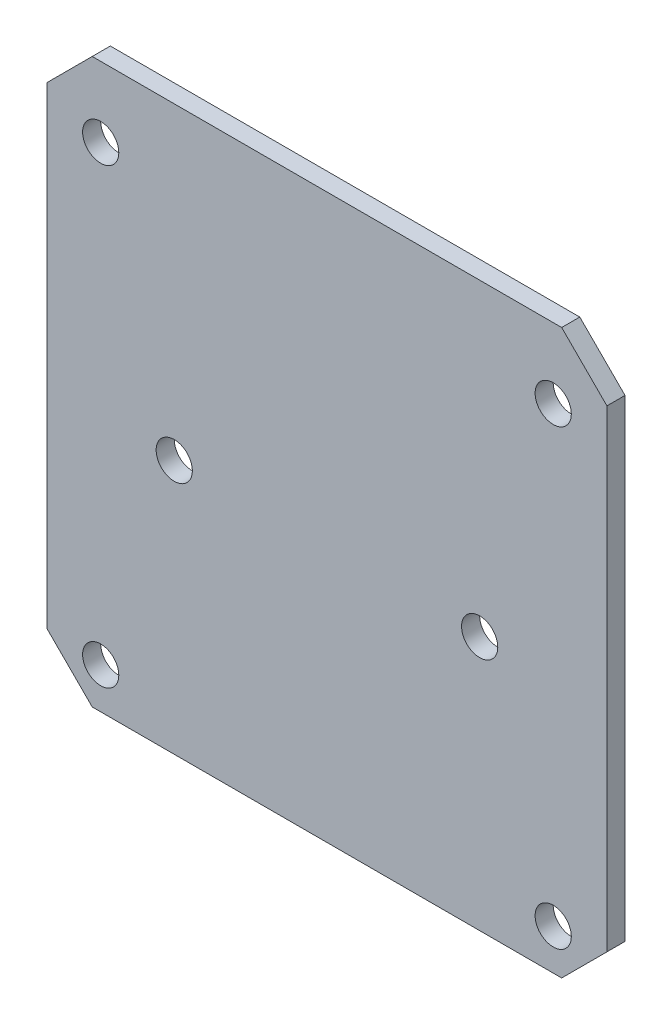
ISO-10303-21;
HEADER;
FILE_DESCRIPTION(('STEP AP214'),'2;1');
FILE_NAME('part.step','',(''),(''),'','','');
FILE_SCHEMA(('AUTOMOTIVE_DESIGN { 1 0 10303 214 1 1 1 1 }'));
ENDSEC;
DATA;
#1=APPLICATION_CONTEXT('core data for automotive mechanical design processes');
#2=APPLICATION_PROTOCOL_DEFINITION('international standard','automotive_design',2000,#1);
#3=PRODUCT_CONTEXT('',#1,'mechanical');
#4=PRODUCT('Part','Part','',(#3));
#5=PRODUCT_RELATED_PRODUCT_CATEGORY('part','',(#4));
#6=PRODUCT_DEFINITION_FORMATION('','',#4);
#7=PRODUCT_DEFINITION_CONTEXT('part definition',#1,'design');
#8=PRODUCT_DEFINITION('design','',#6,#7);
#9=PRODUCT_DEFINITION_SHAPE('','',#8);
#10=(LENGTH_UNIT() NAMED_UNIT(*) SI_UNIT(.MILLI.,.METRE.));
#11=(NAMED_UNIT(*) PLANE_ANGLE_UNIT() SI_UNIT($,.RADIAN.));
#12=(NAMED_UNIT(*) SI_UNIT($,.STERADIAN.) SOLID_ANGLE_UNIT());
#13=UNCERTAINTY_MEASURE_WITH_UNIT(LENGTH_MEASURE(1.E-05),#10,'distance_accuracy_value','');
#14=(GEOMETRIC_REPRESENTATION_CONTEXT(3) GLOBAL_UNCERTAINTY_ASSIGNED_CONTEXT((#13)) GLOBAL_UNIT_ASSIGNED_CONTEXT((#10,
#11,#12)) REPRESENTATION_CONTEXT('',''));
#15=CARTESIAN_POINT('',(0.,0.,0.));
#16=DIRECTION('',(0.,0.,1.));
#17=DIRECTION('',(1.,0.,0.));
#18=AXIS2_PLACEMENT_3D('',#15,#16,#17);
#19=CARTESIAN_POINT('',(-20.,18.7,1.6));
#20=DIRECTION('',(0.,0.,1.));
#21=DIRECTION('',(1.,0.,0.));
#22=AXIS2_PLACEMENT_3D('',#19,#20,#21);
#23=CYLINDRICAL_SURFACE('',#22,1.6);
#24=DIRECTION('',(0.,0.,-1.));
#25=VECTOR('',#24,1.);
#26=CARTESIAN_POINT('',(-18.4,18.7,1.6));
#27=LINE('',#26,#25);
#28=CARTESIAN_POINT('',(-18.4,18.7,1.6));
#29=VERTEX_POINT('',#28);
#30=CARTESIAN_POINT('',(-18.4,18.7,0.));
#31=VERTEX_POINT('',#30);
#32=EDGE_CURVE('E11',#29,#31,#27,.T.);
#33=ORIENTED_EDGE('',*,*,#32,.T.);
#34=CARTESIAN_POINT('',(-20.,18.7,0.));
#35=DIRECTION('',(0.,0.,1.));
#36=DIRECTION('',(1.,0.,0.));
#37=AXIS2_PLACEMENT_3D('',#34,#35,#36);
#38=CIRCLE('',#37,1.6);
#39=EDGE_CURVE('E168',#31,#31,#38,.T.);
#40=ORIENTED_EDGE('',*,*,#39,.F.);
#41=ORIENTED_EDGE('',*,*,#32,.F.);
#42=CARTESIAN_POINT('',(-20.,18.7,1.6));
#43=DIRECTION('',(0.,0.,1.));
#44=DIRECTION('',(1.,0.,0.));
#45=AXIS2_PLACEMENT_3D('',#42,#43,#44);
#46=CIRCLE('',#45,1.6);
#47=EDGE_CURVE('E179',#29,#29,#46,.T.);
#48=ORIENTED_EDGE('',*,*,#47,.T.);
#49=EDGE_LOOP('',(#33,#40,#41,#48));
#50=FACE_BOUND('',#49,.T.);
#51=ADVANCED_FACE('F16',(#50),#23,.F.);
#52=CARTESIAN_POINT('',(20.,18.7,1.6));
#53=DIRECTION('',(0.,0.,1.));
#54=DIRECTION('',(1.,0.,0.));
#55=AXIS2_PLACEMENT_3D('',#52,#53,#54);
#56=CYLINDRICAL_SURFACE('',#55,1.6);
#57=DIRECTION('',(0.,0.,-1.));
#58=VECTOR('',#57,1.);
#59=CARTESIAN_POINT('',(21.6,18.7,1.6));
#60=LINE('',#59,#58);
#61=CARTESIAN_POINT('',(21.6,18.7,1.6));
#62=VERTEX_POINT('',#61);
#63=CARTESIAN_POINT('',(21.6,18.7,0.));
#64=VERTEX_POINT('',#63);
#65=EDGE_CURVE('E27',#62,#64,#60,.T.);
#66=ORIENTED_EDGE('',*,*,#65,.T.);
#67=CARTESIAN_POINT('',(20.,18.7,0.));
#68=DIRECTION('',(0.,0.,1.));
#69=DIRECTION('',(1.,0.,0.));
#70=AXIS2_PLACEMENT_3D('',#67,#68,#69);
#71=CIRCLE('',#70,1.6);
#72=EDGE_CURVE('E196',#64,#64,#71,.T.);
#73=ORIENTED_EDGE('',*,*,#72,.F.);
#74=ORIENTED_EDGE('',*,*,#65,.F.);
#75=CARTESIAN_POINT('',(20.,18.7,1.6));
#76=DIRECTION('',(0.,0.,1.));
#77=DIRECTION('',(1.,0.,0.));
#78=AXIS2_PLACEMENT_3D('',#75,#76,#77);
#79=CIRCLE('',#78,1.6);
#80=EDGE_CURVE('E175',#62,#62,#79,.T.);
#81=ORIENTED_EDGE('',*,*,#80,.T.);
#82=EDGE_LOOP('',(#66,#73,#74,#81));
#83=FACE_BOUND('',#82,.T.);
#84=ADVANCED_FACE('F480',(#83),#56,.F.);
#85=CARTESIAN_POINT('',(-13.5,-2.4,1.6));
#86=DIRECTION('',(0.,0.,1.));
#87=DIRECTION('',(1.,0.,0.));
#88=AXIS2_PLACEMENT_3D('',#85,#86,#87);
#89=CYLINDRICAL_SURFACE('',#88,1.6);
#90=DIRECTION('',(0.,0.,-1.));
#91=VECTOR('',#90,1.);
#92=CARTESIAN_POINT('',(-11.9,-2.4,1.6));
#93=LINE('',#92,#91);
#94=CARTESIAN_POINT('',(-11.9,-2.4,1.6));
#95=VERTEX_POINT('',#94);
#96=CARTESIAN_POINT('',(-11.9,-2.4,0.));
#97=VERTEX_POINT('',#96);
#98=EDGE_CURVE('E217',#95,#97,#93,.T.);
#99=ORIENTED_EDGE('',*,*,#98,.T.);
#100=CARTESIAN_POINT('',(-13.5,-2.4,0.));
#101=DIRECTION('',(0.,0.,1.));
#102=DIRECTION('',(1.,0.,0.));
#103=AXIS2_PLACEMENT_3D('',#100,#101,#102);
#104=CIRCLE('',#103,1.6);
#105=EDGE_CURVE('E192',#97,#97,#104,.T.);
#106=ORIENTED_EDGE('',*,*,#105,.F.);
#107=ORIENTED_EDGE('',*,*,#98,.F.);
#108=CARTESIAN_POINT('',(-13.5,-2.4,1.6));
#109=DIRECTION('',(0.,0.,1.));
#110=DIRECTION('',(1.,0.,0.));
#111=AXIS2_PLACEMENT_3D('',#108,#109,#110);
#112=CIRCLE('',#111,1.6);
#113=EDGE_CURVE('E180',#95,#95,#112,.T.);
#114=ORIENTED_EDGE('',*,*,#113,.T.);
#115=EDGE_LOOP('',(#99,#106,#107,#114));
#116=FACE_BOUND('',#115,.T.);
#117=ADVANCED_FACE('F259',(#116),#89,.F.);
#118=CARTESIAN_POINT('',(-20.,-21.3,1.6));
#119=DIRECTION('',(0.,0.,1.));
#120=DIRECTION('',(1.,0.,0.));
#121=AXIS2_PLACEMENT_3D('',#118,#119,#120);
#122=CYLINDRICAL_SURFACE('',#121,1.6);
#123=DIRECTION('',(0.,0.,-1.));
#124=VECTOR('',#123,1.);
#125=CARTESIAN_POINT('',(-18.4,-21.3,1.6));
#126=LINE('',#125,#124);
#127=CARTESIAN_POINT('',(-18.4,-21.3,1.6));
#128=VERTEX_POINT('',#127);
#129=CARTESIAN_POINT('',(-18.4,-21.3,0.));
#130=VERTEX_POINT('',#129);
#131=EDGE_CURVE('E207',#128,#130,#126,.T.);
#132=ORIENTED_EDGE('',*,*,#131,.T.);
#133=CARTESIAN_POINT('',(-20.,-21.3,0.));
#134=DIRECTION('',(0.,0.,1.));
#135=DIRECTION('',(1.,0.,0.));
#136=AXIS2_PLACEMENT_3D('',#133,#134,#135);
#137=CIRCLE('',#136,1.6);
#138=EDGE_CURVE('E197',#130,#130,#137,.T.);
#139=ORIENTED_EDGE('',*,*,#138,.F.);
#140=ORIENTED_EDGE('',*,*,#131,.F.);
#141=CARTESIAN_POINT('',(-20.,-21.3,1.6));
#142=DIRECTION('',(0.,0.,1.));
#143=DIRECTION('',(1.,0.,0.));
#144=AXIS2_PLACEMENT_3D('',#141,#142,#143);
#145=CIRCLE('',#144,1.6);
#146=EDGE_CURVE('E184',#128,#128,#145,.T.);
#147=ORIENTED_EDGE('',*,*,#146,.T.);
#148=EDGE_LOOP('',(#132,#139,#140,#147));
#149=FACE_BOUND('',#148,.T.);
#150=ADVANCED_FACE('F309',(#149),#122,.F.);
#151=CARTESIAN_POINT('',(13.5,-2.4,1.6));
#152=DIRECTION('',(0.,0.,1.));
#153=DIRECTION('',(1.,0.,0.));
#154=AXIS2_PLACEMENT_3D('',#151,#152,#153);
#155=CYLINDRICAL_SURFACE('',#154,1.6);
#156=DIRECTION('',(0.,0.,-1.));
#157=VECTOR('',#156,1.);
#158=CARTESIAN_POINT('',(15.1,-2.4,1.6));
#159=LINE('',#158,#157);
#160=CARTESIAN_POINT('',(15.1,-2.4,1.6));
#161=VERTEX_POINT('',#160);
#162=CARTESIAN_POINT('',(15.1,-2.4,0.));
#163=VERTEX_POINT('',#162);
#164=EDGE_CURVE('E99',#161,#163,#159,.T.);
#165=ORIENTED_EDGE('',*,*,#164,.T.);
#166=CARTESIAN_POINT('',(13.5,-2.4,0.));
#167=DIRECTION('',(0.,0.,1.));
#168=DIRECTION('',(1.,0.,0.));
#169=AXIS2_PLACEMENT_3D('',#166,#167,#168);
#170=CIRCLE('',#169,1.6);
#171=EDGE_CURVE('E190',#163,#163,#170,.T.);
#172=ORIENTED_EDGE('',*,*,#171,.F.);
#173=ORIENTED_EDGE('',*,*,#164,.F.);
#174=CARTESIAN_POINT('',(13.5,-2.4,1.6));
#175=DIRECTION('',(0.,0.,1.));
#176=DIRECTION('',(1.,0.,0.));
#177=AXIS2_PLACEMENT_3D('',#174,#175,#176);
#178=CIRCLE('',#177,1.6);
#179=EDGE_CURVE('E181',#161,#161,#178,.T.);
#180=ORIENTED_EDGE('',*,*,#179,.T.);
#181=EDGE_LOOP('',(#165,#172,#173,#180));
#182=FACE_BOUND('',#181,.T.);
#183=ADVANCED_FACE('F494',(#182),#155,.F.);
#184=CARTESIAN_POINT('',(20.,-21.3,1.6));
#185=DIRECTION('',(0.,0.,1.));
#186=DIRECTION('',(1.,0.,0.));
#187=AXIS2_PLACEMENT_3D('',#184,#185,#186);
#188=CYLINDRICAL_SURFACE('',#187,1.6);
#189=DIRECTION('',(0.,0.,-1.));
#190=VECTOR('',#189,1.);
#191=CARTESIAN_POINT('',(21.6,-21.3,1.6));
#192=LINE('',#191,#190);
#193=CARTESIAN_POINT('',(21.6,-21.3,1.6));
#194=VERTEX_POINT('',#193);
#195=CARTESIAN_POINT('',(21.6,-21.3,0.));
#196=VERTEX_POINT('',#195);
#197=EDGE_CURVE('E107',#194,#196,#192,.T.);
#198=ORIENTED_EDGE('',*,*,#197,.T.);
#199=CARTESIAN_POINT('',(20.,-21.3,0.));
#200=DIRECTION('',(0.,0.,1.));
#201=DIRECTION('',(1.,0.,0.));
#202=AXIS2_PLACEMENT_3D('',#199,#200,#201);
#203=CIRCLE('',#202,1.6);
#204=EDGE_CURVE('E186',#196,#196,#203,.T.);
#205=ORIENTED_EDGE('',*,*,#204,.F.);
#206=ORIENTED_EDGE('',*,*,#197,.F.);
#207=CARTESIAN_POINT('',(20.,-21.3,1.6));
#208=DIRECTION('',(0.,0.,1.));
#209=DIRECTION('',(1.,0.,0.));
#210=AXIS2_PLACEMENT_3D('',#207,#208,#209);
#211=CIRCLE('',#210,1.6);
#212=EDGE_CURVE('E185',#194,#194,#211,.T.);
#213=ORIENTED_EDGE('',*,*,#212,.T.);
#214=EDGE_LOOP('',(#198,#205,#206,#213));
#215=FACE_BOUND('',#214,.T.);
#216=ADVANCED_FACE('F273',(#215),#188,.F.);
#217=CARTESIAN_POINT('',(24.75,-24.9,0.));
#218=DIRECTION('',(0.,-1.,0.));
#219=DIRECTION('',(0.,0.,-1.));
#220=AXIS2_PLACEMENT_3D('',#217,#218,#219);
#221=PLANE('',#220);
#222=DIRECTION('',(-1.,0.,0.));
#223=VECTOR('',#222,1.);
#224=CARTESIAN_POINT('',(24.75,-24.9,0.));
#225=LINE('',#224,#223);
#226=CARTESIAN_POINT('',(20.75,-24.9,0.));
#227=VERTEX_POINT('',#226);
#228=CARTESIAN_POINT('',(-20.75,-24.9,0.));
#229=VERTEX_POINT('',#228);
#230=EDGE_CURVE('E211',#227,#229,#225,.T.);
#231=ORIENTED_EDGE('',*,*,#230,.F.);
#232=DIRECTION('',(0.,0.,1.));
#233=VECTOR('',#232,1.);
#234=CARTESIAN_POINT('',(20.75,-24.9,0.));
#235=LINE('',#234,#233);
#236=CARTESIAN_POINT('',(20.75,-24.9,1.6));
#237=VERTEX_POINT('',#236);
#238=EDGE_CURVE('E143',#227,#237,#235,.T.);
#239=ORIENTED_EDGE('',*,*,#238,.T.);
#240=DIRECTION('',(-1.,0.,0.));
#241=VECTOR('',#240,1.);
#242=CARTESIAN_POINT('',(24.75,-24.9,1.6));
#243=LINE('',#242,#241);
#244=CARTESIAN_POINT('',(-20.75,-24.9,1.6));
#245=VERTEX_POINT('',#244);
#246=EDGE_CURVE('E146',#237,#245,#243,.T.);
#247=ORIENTED_EDGE('',*,*,#246,.T.);
#248=DIRECTION('',(0.,0.,1.));
#249=VECTOR('',#248,1.);
#250=CARTESIAN_POINT('',(-20.75,-24.9,0.));
#251=LINE('',#250,#249);
#252=EDGE_CURVE('E131',#229,#245,#251,.T.);
#253=ORIENTED_EDGE('',*,*,#252,.F.);
#254=EDGE_LOOP('',(#231,#239,#247,#253));
#255=FACE_BOUND('',#254,.T.);
#256=ADVANCED_FACE('F147',(#255),#221,.T.);
#257=CARTESIAN_POINT('',(22.75,-22.9,0.));
#258=DIRECTION('',(0.707106781186548,-0.707106781186548,0.));
#259=DIRECTION('',(0.,0.,-1.));
#260=AXIS2_PLACEMENT_3D('',#257,#258,#259);
#261=PLANE('',#260);
#262=DIRECTION('',(-0.707106781186548,-0.707106781186548,0.));
#263=VECTOR('',#262,1.);
#264=CARTESIAN_POINT('',(22.7875,-22.8625,0.));
#265=LINE('',#264,#263);
#266=CARTESIAN_POINT('',(24.75,-20.9,0.));
#267=VERTEX_POINT('',#266);
#268=EDGE_CURVE('E173',#267,#227,#265,.T.);
#269=ORIENTED_EDGE('',*,*,#268,.F.);
#270=DIRECTION('',(0.,0.,1.));
#271=VECTOR('',#270,1.);
#272=CARTESIAN_POINT('',(24.75,-20.9,0.));
#273=LINE('',#272,#271);
#274=CARTESIAN_POINT('',(24.75,-20.9,1.6));
#275=VERTEX_POINT('',#274);
#276=EDGE_CURVE('E118',#267,#275,#273,.T.);
#277=ORIENTED_EDGE('',*,*,#276,.T.);
#278=DIRECTION('',(-0.707106781186548,-0.707106781186548,0.));
#279=VECTOR('',#278,1.);
#280=CARTESIAN_POINT('',(22.7875,-22.8625,1.6));
#281=LINE('',#280,#279);
#282=EDGE_CURVE('E152',#275,#237,#281,.T.);
#283=ORIENTED_EDGE('',*,*,#282,.T.);
#284=ORIENTED_EDGE('',*,*,#238,.F.);
#285=EDGE_LOOP('',(#269,#277,#283,#284));
#286=FACE_BOUND('',#285,.T.);
#287=ADVANCED_FACE('F18',(#286),#261,.T.);
#288=CARTESIAN_POINT('',(-22.75,-22.9,0.));
#289=DIRECTION('',(-0.707106781186548,-0.707106781186548,0.));
#290=DIRECTION('',(-0.707106781186548,0.707106781186548,0.));
#291=AXIS2_PLACEMENT_3D('',#288,#289,#290);
#292=PLANE('',#291);
#293=DIRECTION('',(-0.707106781186548,0.707106781186548,0.));
#294=VECTOR('',#293,1.);
#295=CARTESIAN_POINT('',(-22.7875,-22.8625,0.));
#296=LINE('',#295,#294);
#297=CARTESIAN_POINT('',(-24.75,-20.9,0.));
#298=VERTEX_POINT('',#297);
#299=EDGE_CURVE('E138',#229,#298,#296,.T.);
#300=ORIENTED_EDGE('',*,*,#299,.F.);
#301=ORIENTED_EDGE('',*,*,#252,.T.);
#302=DIRECTION('',(-0.707106781186548,0.707106781186548,0.));
#303=VECTOR('',#302,1.);
#304=CARTESIAN_POINT('',(-22.7875,-22.8625,1.6));
#305=LINE('',#304,#303);
#306=CARTESIAN_POINT('',(-24.75,-20.9,1.6));
#307=VERTEX_POINT('',#306);
#308=EDGE_CURVE('E135',#245,#307,#305,.T.);
#309=ORIENTED_EDGE('',*,*,#308,.T.);
#310=DIRECTION('',(0.,0.,1.));
#311=VECTOR('',#310,1.);
#312=CARTESIAN_POINT('',(-24.75,-20.9,0.));
#313=LINE('',#312,#311);
#314=EDGE_CURVE('E20',#298,#307,#313,.T.);
#315=ORIENTED_EDGE('',*,*,#314,.F.);
#316=EDGE_LOOP('',(#300,#301,#309,#315));
#317=FACE_BOUND('',#316,.T.);
#318=ADVANCED_FACE('F133',(#317),#292,.T.);
#319=CARTESIAN_POINT('',(24.75,24.9,0.));
#320=DIRECTION('',(1.,0.,0.));
#321=DIRECTION('',(0.,1.,0.));
#322=AXIS2_PLACEMENT_3D('',#319,#320,#321);
#323=PLANE('',#322);
#324=DIRECTION('',(0.,-1.,0.));
#325=VECTOR('',#324,1.);
#326=CARTESIAN_POINT('',(24.75,24.9,0.));
#327=LINE('',#326,#325);
#328=CARTESIAN_POINT('',(24.75,20.9,0.));
#329=VERTEX_POINT('',#328);
#330=EDGE_CURVE('E169',#329,#267,#327,.T.);
#331=ORIENTED_EDGE('',*,*,#330,.F.);
#332=DIRECTION('',(0.,0.,1.));
#333=VECTOR('',#332,1.);
#334=CARTESIAN_POINT('',(24.75,20.9,0.));
#335=LINE('',#334,#333);
#336=CARTESIAN_POINT('',(24.75,20.9,1.6));
#337=VERTEX_POINT('',#336);
#338=EDGE_CURVE('E164',#329,#337,#335,.T.);
#339=ORIENTED_EDGE('',*,*,#338,.T.);
#340=DIRECTION('',(0.,-1.,0.));
#341=VECTOR('',#340,1.);
#342=CARTESIAN_POINT('',(24.75,24.9,1.6));
#343=LINE('',#342,#341);
#344=EDGE_CURVE('E198',#337,#275,#343,.T.);
#345=ORIENTED_EDGE('',*,*,#344,.T.);
#346=ORIENTED_EDGE('',*,*,#276,.F.);
#347=EDGE_LOOP('',(#331,#339,#345,#346));
#348=FACE_BOUND('',#347,.T.);
#349=ADVANCED_FACE('F501',(#348),#323,.T.);
#350=CARTESIAN_POINT('',(-24.75,-24.9,0.));
#351=DIRECTION('',(-1.,0.,0.));
#352=DIRECTION('',(0.,0.,1.));
#353=AXIS2_PLACEMENT_3D('',#350,#351,#352);
#354=PLANE('',#353);
#355=DIRECTION('',(0.,1.,0.));
#356=VECTOR('',#355,1.);
#357=CARTESIAN_POINT('',(-24.75,-24.9,0.));
#358=LINE('',#357,#356);
#359=CARTESIAN_POINT('',(-24.75,20.9,0.));
#360=VERTEX_POINT('',#359);
#361=EDGE_CURVE('E210',#298,#360,#358,.T.);
#362=ORIENTED_EDGE('',*,*,#361,.F.);
#363=ORIENTED_EDGE('',*,*,#314,.T.);
#364=DIRECTION('',(0.,1.,0.));
#365=VECTOR('',#364,1.);
#366=CARTESIAN_POINT('',(-24.75,-24.9,1.6));
#367=LINE('',#366,#365);
#368=CARTESIAN_POINT('',(-24.75,20.9,1.6));
#369=VERTEX_POINT('',#368);
#370=EDGE_CURVE('E157',#307,#369,#367,.T.);
#371=ORIENTED_EDGE('',*,*,#370,.T.);
#372=DIRECTION('',(0.,0.,1.));
#373=VECTOR('',#372,1.);
#374=CARTESIAN_POINT('',(-24.75,20.9,0.));
#375=LINE('',#374,#373);
#376=EDGE_CURVE('E250',#360,#369,#375,.T.);
#377=ORIENTED_EDGE('',*,*,#376,.F.);
#378=EDGE_LOOP('',(#362,#363,#371,#377));
#379=FACE_BOUND('',#378,.T.);
#380=ADVANCED_FACE('F265',(#379),#354,.T.);
#381=CARTESIAN_POINT('',(0.,0.,1.6));
#382=DIRECTION('',(0.,0.,-1.));
#383=DIRECTION('',(0.,-1.,0.));
#384=AXIS2_PLACEMENT_3D('',#381,#382,#383);
#385=PLANE('',#384);
#386=ORIENTED_EDGE('',*,*,#47,.F.);
#387=EDGE_LOOP('',(#386));
#388=FACE_BOUND('',#387,.T.);
#389=ORIENTED_EDGE('',*,*,#80,.F.);
#390=EDGE_LOOP('',(#389));
#391=FACE_BOUND('',#390,.T.);
#392=ORIENTED_EDGE('',*,*,#113,.F.);
#393=EDGE_LOOP('',(#392));
#394=FACE_BOUND('',#393,.T.);
#395=ORIENTED_EDGE('',*,*,#146,.F.);
#396=EDGE_LOOP('',(#395));
#397=FACE_BOUND('',#396,.T.);
#398=ORIENTED_EDGE('',*,*,#179,.F.);
#399=EDGE_LOOP('',(#398));
#400=FACE_BOUND('',#399,.T.);
#401=ORIENTED_EDGE('',*,*,#212,.F.);
#402=EDGE_LOOP('',(#401));
#403=FACE_BOUND('',#402,.T.);
#404=DIRECTION('',(-0.707106781186548,-0.707106781186548,0.));
#405=VECTOR('',#404,1.);
#406=CARTESIAN_POINT('',(-22.7875,22.8625,1.6));
#407=LINE('',#406,#405);
#408=CARTESIAN_POINT('',(-20.75,24.9,1.6));
#409=VERTEX_POINT('',#408);
#410=EDGE_CURVE('E247',#409,#369,#407,.T.);
#411=ORIENTED_EDGE('',*,*,#410,.T.);
#412=ORIENTED_EDGE('',*,*,#370,.F.);
#413=ORIENTED_EDGE('',*,*,#308,.F.);
#414=ORIENTED_EDGE('',*,*,#246,.F.);
#415=ORIENTED_EDGE('',*,*,#282,.F.);
#416=ORIENTED_EDGE('',*,*,#344,.F.);
#417=DIRECTION('',(0.707106781186548,-0.707106781186548,0.));
#418=VECTOR('',#417,1.);
#419=CARTESIAN_POINT('',(22.7875,22.8625,1.6));
#420=LINE('',#419,#418);
#421=CARTESIAN_POINT('',(20.75,24.9,1.6));
#422=VERTEX_POINT('',#421);
#423=EDGE_CURVE('E241',#422,#337,#420,.T.);
#424=ORIENTED_EDGE('',*,*,#423,.F.);
#425=DIRECTION('',(1.,0.,0.));
#426=VECTOR('',#425,1.);
#427=CARTESIAN_POINT('',(-24.75,24.9,1.6));
#428=LINE('',#427,#426);
#429=EDGE_CURVE('E226',#409,#422,#428,.T.);
#430=ORIENTED_EDGE('',*,*,#429,.F.);
#431=EDGE_LOOP('',(#411,#412,#413,#414,#415,#416,#424,#430));
#432=FACE_BOUND('',#431,.T.);
#433=ADVANCED_FACE('F155',(#388,#391,#394,#397,#400,#403,#432),#385,.F.);
#434=CARTESIAN_POINT('',(22.75,22.9,0.));
#435=DIRECTION('',(0.707106781186548,0.707106781186548,0.));
#436=DIRECTION('',(0.,0.,-1.));
#437=AXIS2_PLACEMENT_3D('',#434,#435,#436);
#438=PLANE('',#437);
#439=DIRECTION('',(0.707106781186548,-0.707106781186548,0.));
#440=VECTOR('',#439,1.);
#441=CARTESIAN_POINT('',(22.7875,22.8625,0.));
#442=LINE('',#441,#440);
#443=CARTESIAN_POINT('',(20.75,24.9,0.));
#444=VERTEX_POINT('',#443);
#445=EDGE_CURVE('E174',#444,#329,#442,.T.);
#446=ORIENTED_EDGE('',*,*,#445,.F.);
#447=DIRECTION('',(0.,0.,1.));
#448=VECTOR('',#447,1.);
#449=CARTESIAN_POINT('',(20.75,24.9,0.));
#450=LINE('',#449,#448);
#451=EDGE_CURVE('E230',#444,#422,#450,.T.);
#452=ORIENTED_EDGE('',*,*,#451,.T.);
#453=ORIENTED_EDGE('',*,*,#423,.T.);
#454=ORIENTED_EDGE('',*,*,#338,.F.);
#455=EDGE_LOOP('',(#446,#452,#453,#454));
#456=FACE_BOUND('',#455,.T.);
#457=ADVANCED_FACE('F264',(#456),#438,.T.);
#458=CARTESIAN_POINT('',(-22.75,22.9,0.));
#459=DIRECTION('',(-0.707106781186548,0.707106781186548,0.));
#460=DIRECTION('',(0.,0.,1.));
#461=AXIS2_PLACEMENT_3D('',#458,#459,#460);
#462=PLANE('',#461);
#463=ORIENTED_EDGE('',*,*,#376,.T.);
#464=ORIENTED_EDGE('',*,*,#410,.F.);
#465=DIRECTION('',(0.,0.,1.));
#466=VECTOR('',#465,1.);
#467=CARTESIAN_POINT('',(-20.75,24.9,0.));
#468=LINE('',#467,#466);
#469=CARTESIAN_POINT('',(-20.75,24.9,0.));
#470=VERTEX_POINT('',#469);
#471=EDGE_CURVE('E224',#470,#409,#468,.T.);
#472=ORIENTED_EDGE('',*,*,#471,.F.);
#473=DIRECTION('',(-0.707106781186548,-0.707106781186548,0.));
#474=VECTOR('',#473,1.);
#475=CARTESIAN_POINT('',(-22.7875,22.8625,0.));
#476=LINE('',#475,#474);
#477=EDGE_CURVE('E191',#470,#360,#476,.T.);
#478=ORIENTED_EDGE('',*,*,#477,.T.);
#479=EDGE_LOOP('',(#463,#464,#472,#478));
#480=FACE_BOUND('',#479,.T.);
#481=ADVANCED_FACE('F279',(#480),#462,.T.);
#482=CARTESIAN_POINT('',(0.,0.,0.));
#483=DIRECTION('',(0.,0.,-1.));
#484=DIRECTION('',(0.,-1.,0.));
#485=AXIS2_PLACEMENT_3D('',#482,#483,#484);
#486=PLANE('',#485);
#487=ORIENTED_EDGE('',*,*,#39,.T.);
#488=EDGE_LOOP('',(#487));
#489=FACE_BOUND('',#488,.T.);
#490=ORIENTED_EDGE('',*,*,#72,.T.);
#491=EDGE_LOOP('',(#490));
#492=FACE_BOUND('',#491,.T.);
#493=ORIENTED_EDGE('',*,*,#105,.T.);
#494=EDGE_LOOP('',(#493));
#495=FACE_BOUND('',#494,.T.);
#496=ORIENTED_EDGE('',*,*,#138,.T.);
#497=EDGE_LOOP('',(#496));
#498=FACE_BOUND('',#497,.T.);
#499=ORIENTED_EDGE('',*,*,#171,.T.);
#500=EDGE_LOOP('',(#499));
#501=FACE_BOUND('',#500,.T.);
#502=ORIENTED_EDGE('',*,*,#204,.T.);
#503=EDGE_LOOP('',(#502));
#504=FACE_BOUND('',#503,.T.);
#505=DIRECTION('',(1.,0.,0.));
#506=VECTOR('',#505,1.);
#507=CARTESIAN_POINT('',(-24.75,24.9,0.));
#508=LINE('',#507,#506);
#509=EDGE_CURVE('E221',#470,#444,#508,.T.);
#510=ORIENTED_EDGE('',*,*,#509,.T.);
#511=ORIENTED_EDGE('',*,*,#445,.T.);
#512=ORIENTED_EDGE('',*,*,#330,.T.);
#513=ORIENTED_EDGE('',*,*,#268,.T.);
#514=ORIENTED_EDGE('',*,*,#230,.T.);
#515=ORIENTED_EDGE('',*,*,#299,.T.);
#516=ORIENTED_EDGE('',*,*,#361,.T.);
#517=ORIENTED_EDGE('',*,*,#477,.F.);
#518=EDGE_LOOP('',(#510,#511,#512,#513,#514,#515,#516,#517));
#519=FACE_BOUND('',#518,.T.);
#520=ADVANCED_FACE('F275',(#489,#492,#495,#498,#501,#504,#519),#486,.T.);
#521=CARTESIAN_POINT('',(-24.75,24.9,0.));
#522=DIRECTION('',(0.,1.,0.));
#523=DIRECTION('',(1.,0.,0.));
#524=AXIS2_PLACEMENT_3D('',#521,#522,#523);
#525=PLANE('',#524);
#526=ORIENTED_EDGE('',*,*,#509,.F.);
#527=ORIENTED_EDGE('',*,*,#471,.T.);
#528=ORIENTED_EDGE('',*,*,#429,.T.);
#529=ORIENTED_EDGE('',*,*,#451,.F.);
#530=EDGE_LOOP('',(#526,#527,#528,#529));
#531=FACE_BOUND('',#530,.T.);
#532=ADVANCED_FACE('F278',(#531),#525,.T.);
#533=CLOSED_SHELL('',(#51,#84,#117,#150,#183,#216,#256,#287,#318,#349,#380,#433,#457,#481,#520,#532));
#534=MANIFOLD_SOLID_BREP('B1',#533);
#535=ADVANCED_BREP_SHAPE_REPRESENTATION('',(#18,#534),#14);
#536=SHAPE_DEFINITION_REPRESENTATION(#9,#535);
ENDSEC;
END-ISO-10303-21;
